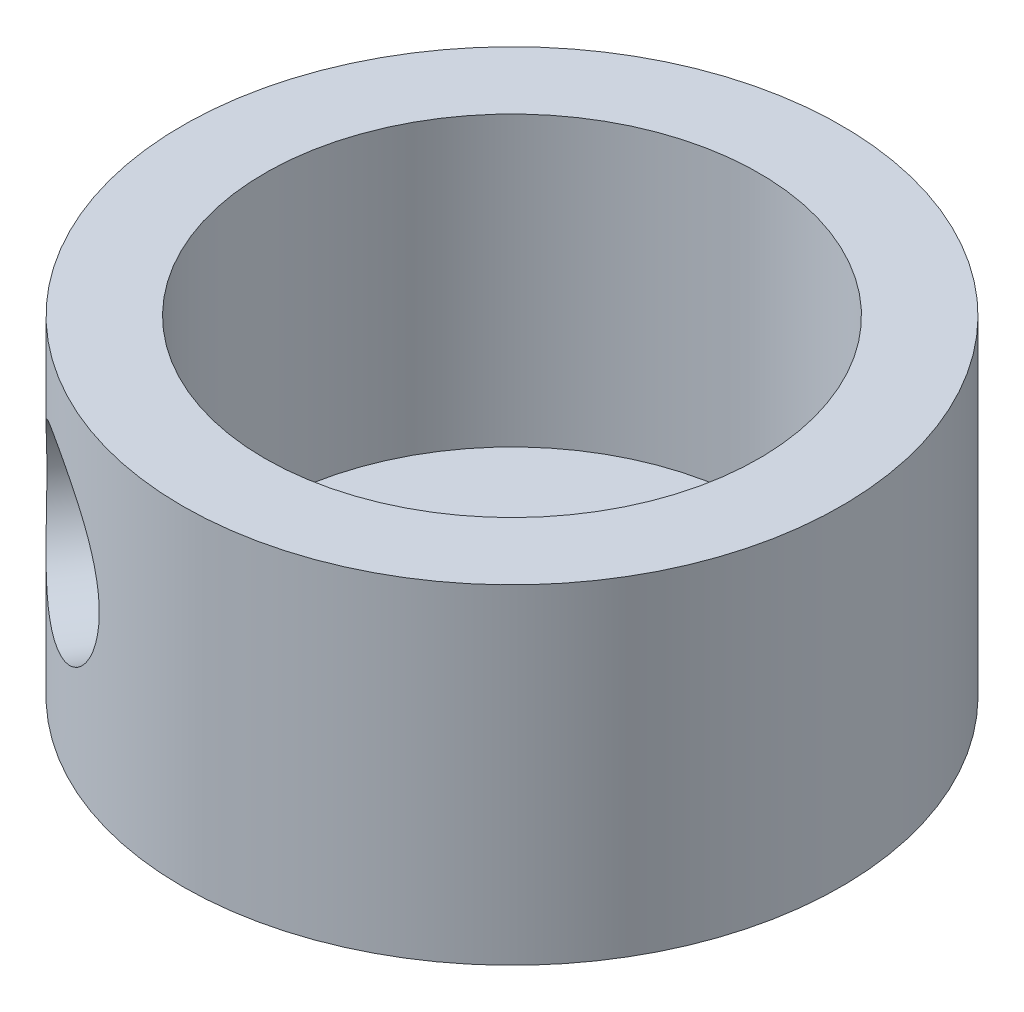
ISO-10303-21;
HEADER;
FILE_DESCRIPTION(('STEP AP214'),'2;1');
FILE_NAME('part.step','',(''),(''),'','','');
FILE_SCHEMA(('AUTOMOTIVE_DESIGN { 1 0 10303 214 1 1 1 1 }'));
ENDSEC;
DATA;
#1=APPLICATION_CONTEXT('core data for automotive mechanical design processes');
#2=APPLICATION_PROTOCOL_DEFINITION('international standard','automotive_design',2000,#1);
#3=PRODUCT_CONTEXT('',#1,'mechanical');
#4=PRODUCT('Part','Part','',(#3));
#5=PRODUCT_RELATED_PRODUCT_CATEGORY('part','',(#4));
#6=PRODUCT_DEFINITION_FORMATION('','',#4);
#7=PRODUCT_DEFINITION_CONTEXT('part definition',#1,'design');
#8=PRODUCT_DEFINITION('design','',#6,#7);
#9=PRODUCT_DEFINITION_SHAPE('','',#8);
#10=(LENGTH_UNIT() NAMED_UNIT(*) SI_UNIT(.MILLI.,.METRE.));
#11=(NAMED_UNIT(*) PLANE_ANGLE_UNIT() SI_UNIT($,.RADIAN.));
#12=(NAMED_UNIT(*) SI_UNIT($,.STERADIAN.) SOLID_ANGLE_UNIT());
#13=UNCERTAINTY_MEASURE_WITH_UNIT(LENGTH_MEASURE(1.E-05),#10,'distance_accuracy_value','');
#14=(GEOMETRIC_REPRESENTATION_CONTEXT(3) GLOBAL_UNCERTAINTY_ASSIGNED_CONTEXT((#13)) GLOBAL_UNIT_ASSIGNED_CONTEXT((#10,
#11,#12)) REPRESENTATION_CONTEXT('',''));
#15=CARTESIAN_POINT('',(0.,0.,0.));
#16=DIRECTION('',(0.,0.,1.));
#17=DIRECTION('',(1.,0.,0.));
#18=AXIS2_PLACEMENT_3D('',#15,#16,#17);
#19=CARTESIAN_POINT('',(0.,40.,0.));
#20=DIRECTION('',(0.,-1.,0.));
#21=DIRECTION('',(0.,0.,-1.));
#22=AXIS2_PLACEMENT_3D('',#19,#20,#21);
#23=CYLINDRICAL_SURFACE('',#22,40.);
#24=CARTESIAN_POINT('',(-11.9219472936567,21.9418173695324,38.1820268284342));
#25=CARTESIAN_POINT('',(-11.9219485564971,21.6457915739465,38.182026843167));
#26=CARTESIAN_POINT('',(-11.9340787709255,21.3497457965336,38.1782453513896));
#27=CARTESIAN_POINT('',(-11.9824553450911,20.7598129156957,38.1630894279006));
#28=CARTESIAN_POINT('',(-12.0187038933685,20.4659260106176,38.1517143071294));
#29=CARTESIAN_POINT('',(-12.1148984395148,19.8823297375246,38.1212772327024));
#30=CARTESIAN_POINT('',(-12.1748547495308,19.5926222443376,38.102211933983));
#31=CARTESIAN_POINT('',(-12.3177546940238,19.0195795097993,38.0562549797366));
#32=CARTESIAN_POINT('',(-12.4006979052965,18.7362441512365,38.0293634682949));
#33=CARTESIAN_POINT('',(-12.588493324008,18.1782903104285,37.9676122725524));
#34=CARTESIAN_POINT('',(-12.6933137137761,17.9036598289065,37.93276415332));
#35=CARTESIAN_POINT('',(-12.9238038929419,17.3645046043392,37.8548554525593));
#36=CARTESIAN_POINT('',(-13.0494737580811,17.0999798980102,37.8117948411967));
#37=CARTESIAN_POINT('',(-13.3203591763773,16.5827618064964,37.717218862599));
#38=CARTESIAN_POINT('',(-13.4655722716006,16.3300669388622,37.6657045583985));
#39=CARTESIAN_POINT('',(-13.7742032302696,15.8379595348734,37.5539380265715));
#40=CARTESIAN_POINT('',(-13.937627566122,15.5985517664268,37.4936826900079));
#41=CARTESIAN_POINT('',(-14.2850561692093,15.1292897964982,37.3627140958644));
#42=CARTESIAN_POINT('',(-14.4694445888559,14.899777689986,37.291793788663));
#43=CARTESIAN_POINT('',(-14.8539629742205,14.4577512136153,37.1403079477416));
#44=CARTESIAN_POINT('',(-15.0540931356395,14.2452370551412,37.0597422941043));
#45=CARTESIAN_POINT('',(-15.4683907843016,13.8385292354389,36.8887396065427));
#46=CARTESIAN_POINT('',(-15.682562183416,13.6443407167846,36.7982998169874));
#47=CARTESIAN_POINT('',(-16.1229830499921,13.2757152159414,36.6074717028507));
#48=CARTESIAN_POINT('',(-16.3492282697357,13.101271353874,36.5070868665525));
#49=CARTESIAN_POINT('',(-16.8157980179616,12.7705598606028,36.2945686671706));
#50=CARTESIAN_POINT('',(-17.056293361993,12.6146399997014,36.1822686527349));
#51=CARTESIAN_POINT('',(-17.5458256307185,12.3255624159477,35.9474295388858));
#52=CARTESIAN_POINT('',(-17.7948626763768,12.1924050156085,35.8248902944331));
#53=CARTESIAN_POINT('',(-18.2993226229423,11.949933992639,35.5698559245818));
#54=CARTESIAN_POINT('',(-18.5547446734107,11.8406172132646,35.4373621203971));
#55=CARTESIAN_POINT('',(-19.0698324935427,11.6467281810364,35.1628587929198));
#56=CARTESIAN_POINT('',(-19.3294981482725,11.5621552591894,35.0208495270218));
#57=CARTESIAN_POINT('',(-19.8448141613022,11.4201675979211,34.7313784179888));
#58=CARTESIAN_POINT('',(-20.1004175342026,11.3621672182472,34.5841200755444));
#59=CARTESIAN_POINT('',(-20.611535193495,11.2709880200223,34.2819594200829));
#60=CARTESIAN_POINT('',(-20.8670494810871,11.2378088530426,34.1270572143993));
#61=CARTESIAN_POINT('',(-21.3759446004128,11.1965717839178,33.8106307874644));
#62=CARTESIAN_POINT('',(-21.6293257413711,11.1885101759,33.6491075466513));
#63=CARTESIAN_POINT('',(-22.1320598086787,11.1975710893368,33.320595564084));
#64=CARTESIAN_POINT('',(-22.3814127933105,11.2146932460819,33.153606901514));
#65=CARTESIAN_POINT('',(-22.8679440326944,11.2732039867969,32.8198405210869));
#66=CARTESIAN_POINT('',(-23.1052705124985,11.3139587973612,32.6531672828523));
#67=CARTESIAN_POINT('',(-23.5728178050311,11.4188823064588,32.3172573041931));
#68=CARTESIAN_POINT('',(-23.8030387600976,11.4830505356434,32.1480206152209));
#69=CARTESIAN_POINT('',(-24.2549823550968,11.6342772533727,31.8084224263598));
#70=CARTESIAN_POINT('',(-24.4767046985083,11.7213365397671,31.6380608874669));
#71=CARTESIAN_POINT('',(-24.9104031979542,11.9176582002548,31.2977284030765));
#72=CARTESIAN_POINT('',(-25.1223791980566,12.02692092943,31.1277574638696));
#73=CARTESIAN_POINT('',(-25.5375350173561,12.2680074659512,30.7880975227127));
#74=CARTESIAN_POINT('',(-25.740607747789,12.4000427100508,30.6184277552599));
#75=CARTESIAN_POINT('',(-26.1348271607195,12.685004456038,30.282633426567));
#76=CARTESIAN_POINT('',(-26.32596938333,12.8379387031019,30.116510206193));
#77=CARTESIAN_POINT('',(-26.6953937888463,13.1635620975129,29.7895416367364));
#78=CARTESIAN_POINT('',(-26.8736790320872,13.3362465182688,29.6286950366666));
#79=CARTESIAN_POINT('',(-27.2168351356898,13.7003401629277,29.3137877502708));
#80=CARTESIAN_POINT('',(-27.3816997860728,13.8917579659389,29.1597302203365));
#81=CARTESIAN_POINT('',(-27.702274826333,14.2982878599121,28.8554039037298));
#82=CARTESIAN_POINT('',(-27.85753907118,14.5139529068663,28.705403323496));
#83=CARTESIAN_POINT('',(-28.1524846407364,14.9623160255126,28.4161971774449));
#84=CARTESIAN_POINT('',(-28.2921726558098,15.1950067126015,28.2769869847919));
#85=CARTESIAN_POINT('',(-28.555642161083,15.6761143113448,28.010897596477));
#86=CARTESIAN_POINT('',(-28.6794157967291,15.9245388988853,27.8840244972681));
#87=CARTESIAN_POINT('',(-28.9105184330448,16.4352902220906,27.644341905963));
#88=CARTESIAN_POINT('',(-29.0178538962372,16.6976114395448,27.5315268903223));
#89=CARTESIAN_POINT('',(-29.2164274811446,17.2362764256752,27.3207153021079));
#90=CARTESIAN_POINT('',(-29.3075549250433,17.5127011716086,27.2228212218583));
#91=CARTESIAN_POINT('',(-29.472512066956,18.0760536126138,27.0441459351377));
#92=CARTESIAN_POINT('',(-29.5463416299068,18.3629813896739,26.9633648622869));
#93=CARTESIAN_POINT('',(-29.6764090325275,18.9452184499096,26.820143799486));
#94=CARTESIAN_POINT('',(-29.7326505130623,19.2405259845887,26.7577000137434));
#95=CARTESIAN_POINT('',(-29.8273357921299,19.8373782062068,26.6521121122163));
#96=CARTESIAN_POINT('',(-29.865780144195,20.138922698857,26.608967396187));
#97=CARTESIAN_POINT('',(-29.9238176235369,20.7367245050457,26.5436807103941));
#98=CARTESIAN_POINT('',(-29.9439472918706,21.0328646681668,26.520941251032));
#99=CARTESIAN_POINT('',(-29.9672418732739,21.6266580216758,26.4946169637237));
#100=CARTESIAN_POINT('',(-29.9704071279815,21.9243111814734,26.4910317500394));
#101=CARTESIAN_POINT('',(-29.9597608487209,22.5188931267627,26.5030713774279));
#102=CARTESIAN_POINT('',(-29.9459510000315,22.8158219812306,26.5186943115266));
#103=CARTESIAN_POINT('',(-29.9014139985922,23.4067908295362,26.5689021939401));
#104=CARTESIAN_POINT('',(-29.8706869412368,23.7008308396541,26.6034870353303));
#105=CARTESIAN_POINT('',(-29.7932084952579,24.2781515342144,26.6902235048328));
#106=CARTESIAN_POINT('',(-29.746783705601,24.5615301105569,26.7420167492639));
#107=CARTESIAN_POINT('',(-29.6379665001651,25.1215232036923,26.8625674110605));
#108=CARTESIAN_POINT('',(-29.5755743488745,25.3981378324423,26.9313245474299));
#109=CARTESIAN_POINT('',(-29.4350469684794,25.9427610304638,27.0848449922696));
#110=CARTESIAN_POINT('',(-29.3569130234005,26.2107702995911,27.1696069952204));
#111=CARTESIAN_POINT('',(-29.185126737665,26.7366005304803,27.3540537459268));
#112=CARTESIAN_POINT('',(-29.0914684554456,26.9944175444333,27.4537442057703));
#113=CARTESIAN_POINT('',(-28.8867349827514,27.5036768500475,27.6690998428026));
#114=CARTESIAN_POINT('',(-28.7753237675165,27.7548565281405,27.7850666299499));
#115=CARTESIAN_POINT('',(-28.5369318920643,28.2433334794542,28.0298538771151));
#116=CARTESIAN_POINT('',(-28.4099442172606,28.4806244265481,28.158680123267));
#117=CARTESIAN_POINT('',(-28.1408186896456,28.9397680196225,28.4276363737601));
#118=CARTESIAN_POINT('',(-27.9986782984482,29.1616180686195,28.5677682710671));
#119=CARTESIAN_POINT('',(-27.699790938312,29.5883613131097,28.8576662044151));
#120=CARTESIAN_POINT('',(-27.5430502297011,29.793261705773,29.0074281028487));
#121=CARTESIAN_POINT('',(-27.2105420469915,30.1907720759621,29.3196168846646));
#122=CARTESIAN_POINT('',(-27.034345969698,30.3828318173997,29.4822884973719));
#123=CARTESIAN_POINT('',(-26.6677241063644,30.7462999546063,29.8143190747726));
#124=CARTESIAN_POINT('',(-26.4773036043877,30.9177159578676,29.9836755452702));
#125=CARTESIAN_POINT('',(-26.0829572351754,31.2387645471355,30.3273431871627));
#126=CARTESIAN_POINT('',(-25.8790291299339,31.3883935101578,30.5016551768677));
#127=CARTESIAN_POINT('',(-25.4586716911438,31.6646876341004,30.8533810826465));
#128=CARTESIAN_POINT('',(-25.2422425641894,31.7913531743755,31.0307949474244));
#129=CARTESIAN_POINT('',(-24.7997271855806,32.0198259383659,31.3855592268318));
#130=CARTESIAN_POINT('',(-24.5737271749909,32.121815381546,31.5628998057961));
#131=CARTESIAN_POINT('',(-24.1118588112119,32.3013227830568,31.9171263219576));
#132=CARTESIAN_POINT('',(-23.875990475401,32.3788407844803,32.0940122599548));
#133=CARTESIAN_POINT('',(-23.3959342726355,32.5087148631042,32.4456277349932));
#134=CARTESIAN_POINT('',(-23.151747975065,32.5610756589663,32.6203576704343));
#135=CARTESIAN_POINT('',(-22.6567012435308,32.6401818663349,32.9661194432821));
#136=CARTESIAN_POINT('',(-22.4058409823967,32.6669279405,33.1371513762451));
#137=CARTESIAN_POINT('',(-21.9071924931358,32.6941297345157,33.4688179753065));
#138=CARTESIAN_POINT('',(-21.6595522362185,32.6953789360203,33.6296105549388));
#139=CARTESIAN_POINT('',(-21.1615368187537,32.6735958194586,33.9451948990643));
#140=CARTESIAN_POINT('',(-20.9111617189639,32.6505640397422,34.0999867965238));
#141=CARTESIAN_POINT('',(-20.4095636547516,32.5804211668785,34.4025507813085));
#142=CARTESIAN_POINT('',(-20.1583407275301,32.5333111169404,34.5503231724559));
#143=CARTESIAN_POINT('',(-19.6569604289342,32.4154136459086,34.8380173021527));
#144=CARTESIAN_POINT('',(-19.4068030623053,32.3446261194765,34.9779390057721));
#145=CARTESIAN_POINT('',(-18.9112716597198,32.1805465140334,35.2483036213255));
#146=CARTESIAN_POINT('',(-18.6658762378912,32.0874184514624,35.3788069912431));
#147=CARTESIAN_POINT('',(-18.1799410739813,31.8791272952421,35.6309511172041));
#148=CARTESIAN_POINT('',(-17.9394012916231,31.7639643844519,35.752591946783));
#149=CARTESIAN_POINT('',(-17.4650472534092,31.5124697732182,35.9866931297203));
#150=CARTESIAN_POINT('',(-17.2312325086665,31.3761396161944,36.0991541515173));
#151=CARTESIAN_POINT('',(-16.7720311746996,31.0832141707517,36.31478137818));
#152=CARTESIAN_POINT('',(-16.5466478462766,30.9266111442535,36.4179440082478));
#153=CARTESIAN_POINT('',(-16.1002950244833,30.5898084518328,36.6175074015466));
#154=CARTESIAN_POINT('',(-15.879602336511,30.4090919909929,36.7136553612603));
#155=CARTESIAN_POINT('',(-15.4507886756573,30.0285901745662,36.8961714219169));
#156=CARTESIAN_POINT('',(-15.2426734883449,29.8287961508151,36.9825350378617));
#157=CARTESIAN_POINT('',(-14.8408458371242,29.4114577272269,37.1456098532816));
#158=CARTESIAN_POINT('',(-14.6471370511636,29.1939088241068,37.222318591308));
#159=CARTESIAN_POINT('',(-14.2759738868577,28.7425934510263,37.3662438942786));
#160=CARTESIAN_POINT('',(-14.0985123947174,28.5088341582575,37.4334646205518));
#161=CARTESIAN_POINT('',(-13.7575158283389,28.0209573363984,37.5601465015436));
#162=CARTESIAN_POINT('',(-13.5943929307102,27.766496102314,37.6193946130289));
#163=CARTESIAN_POINT('',(-13.2884766135699,27.2438509128868,37.7285404951504));
#164=CARTESIAN_POINT('',(-13.1456756447096,26.9756721040511,37.7784417402232));
#165=CARTESIAN_POINT('',(-12.8819095095361,26.4274311692164,37.8691941186278));
#166=CARTESIAN_POINT('',(-12.7609364933838,26.1473733601113,37.9100485066258));
#167=CARTESIAN_POINT('',(-12.5421472105484,25.5772702188257,37.9829943568181));
#168=CARTESIAN_POINT('',(-12.44432784158,25.2872262306343,38.0150869930609));
#169=CARTESIAN_POINT('',(-12.2867525195498,24.7464622312488,38.0662765610464));
#170=CARTESIAN_POINT('',(-12.223407556036,24.4968997761537,38.0866324611262));
#171=CARTESIAN_POINT('',(-12.1144010516572,23.9935429008398,38.1214450122221));
#172=CARTESIAN_POINT('',(-12.0687382898638,23.7397487740739,38.1359020705477));
#173=CARTESIAN_POINT('',(-11.9955065997944,23.2292800360838,38.1590002355114));
#174=CARTESIAN_POINT('',(-11.9679390464416,22.9726052074827,38.1676409002055));
#175=CARTESIAN_POINT('',(-11.9311615483355,22.4578974884636,38.1791533400785));
#176=CARTESIAN_POINT('',(-11.9219461928303,22.199865020818,38.1820268155916));
#177=CARTESIAN_POINT('',(-11.9219472936567,21.9418173695324,38.1820268284342));
#178=B_SPLINE_CURVE_WITH_KNOTS('',3,(#24,#25,#26,#27,#28,#29,#30,#31,#32,#33,#34,#35,#36,#37,
#38,#39,#40,#41,#42,#43,#44,#45,#46,#47,#48,#49,#50,#51,#52,#53,#54,#55,#56,#57,#58,#59,#60,#61,
#62,#63,#64,#65,#66,#67,#68,#69,#70,#71,#72,#73,#74,#75,#76,#77,#78,#79,#80,#81,#82,#83,#84,#85,
#86,#87,#88,#89,#90,#91,#92,#93,#94,#95,#96,#97,#98,#99,#100,#101,#102,#103,#104,#105,#106,#107,
#108,#109,#110,#111,#112,#113,#114,#115,#116,#117,#118,#119,#120,#121,#122,#123,#124,#125,#126,
#127,#128,#129,#130,#131,#132,#133,#134,#135,#136,#137,#138,#139,#140,#141,#142,#143,#144,#145,
#146,#147,#148,#149,#150,#151,#152,#153,#154,#155,#156,#157,#158,#159,#160,#161,#162,#163,#164,
#165,#166,#167,#168,#169,#170,#171,#172,#173,#174,#175,#176,#177),.UNSPECIFIED.,.T.,.F.,(4,2,2,
2,2,2,2,2,2,2,2,2,2,2,2,2,2,2,2,2,2,2,2,2,2,2,2,2,2,2,2,2,2,2,2,2,2,2,2,2,2,2,2,2,2,2,2,2,2,2,2,
2,2,2,2,2,2,2,2,2,2,2,2,2,2,2,2,2,2,2,2,2,2,2,2,2,4),(0.,0.887840507974519,1.77576159115995,
2.66406931831376,3.5523606922197,4.43936904722844,5.32638062461048,6.21328074745654,
7.10049709244529,8.00793416393877,8.91538251845907,9.82308477020942,10.7304697598127,
11.6528406339944,12.57522457583,13.4974863102662,14.419723107448,15.3205207000083,
16.2213056473539,17.1219576855888,18.0225966807751,18.900131617464,19.7776489639299,
20.6551968996187,21.5327588703271,22.4189567032184,23.3054838564773,24.1917992891741,
25.0785225338523,25.9929136534691,26.9069104948756,27.8213567225084,28.7354425156426,
29.6555487391796,30.5756621467416,31.4955849576591,32.4154791549051,33.3074646798179,
34.1994322414036,35.0913112561059,35.9831852416379,36.8575413332505,37.7318829426866,
38.606153262727,39.4807589643759,40.3744866096577,41.2686182174728,42.1628998464765,
43.0567997749156,43.9774116360205,44.8976831944965,45.8181076113211,46.7385168213895,
47.6519063369105,48.565294244,49.4785107627097,50.3917036556587,51.2764324387353,
52.1611416063061,53.0458124464347,53.9304872224184,54.8088557585797,55.6872170057986,
56.5655142369469,57.4441477048588,58.3461488141123,59.2485617285628,60.1512042433362,
61.0534496314488,61.9763645819301,62.8989357807307,63.8211745373337,64.7432896559887,
65.5174490528884,66.2915549857565,67.0657197304927,67.8396561955417),.UNSPECIFIED.);
#179=CARTESIAN_POINT('',(-11.9219472936567,21.9418173695324,38.1820268284342));
#180=VERTEX_POINT('',#179);
#181=EDGE_CURVE('E47',#180,#180,#178,.T.);
#182=ORIENTED_EDGE('',*,*,#181,.T.);
#183=EDGE_LOOP('',(#182));
#184=FACE_BOUND('',#183,.T.);
#185=CARTESIAN_POINT('',(0.,40.,0.));
#186=DIRECTION('',(0.,1.,0.));
#187=DIRECTION('',(0.,0.,1.));
#188=AXIS2_PLACEMENT_3D('',#185,#186,#187);
#189=CIRCLE('',#188,40.);
#190=CARTESIAN_POINT('',(0.,40.,40.));
#191=VERTEX_POINT('',#190);
#192=EDGE_CURVE('E10',#191,#191,#189,.T.);
#193=ORIENTED_EDGE('',*,*,#192,.F.);
#194=EDGE_LOOP('',(#193));
#195=FACE_BOUND('',#194,.T.);
#196=CARTESIAN_POINT('',(0.,0.,0.));
#197=DIRECTION('',(0.,1.,0.));
#198=DIRECTION('',(0.,0.,1.));
#199=AXIS2_PLACEMENT_3D('',#196,#197,#198);
#200=CIRCLE('',#199,40.);
#201=CARTESIAN_POINT('',(0.,0.,40.));
#202=VERTEX_POINT('',#201);
#203=EDGE_CURVE('E35',#202,#202,#200,.T.);
#204=ORIENTED_EDGE('',*,*,#203,.T.);
#205=EDGE_LOOP('',(#204));
#206=FACE_BOUND('',#205,.T.);
#207=ADVANCED_FACE('F31',(#184,#195,#206),#23,.T.);
#208=CARTESIAN_POINT('',(0.,40.,0.));
#209=DIRECTION('',(0.,1.,0.));
#210=DIRECTION('',(0.,0.,1.));
#211=AXIS2_PLACEMENT_3D('',#208,#209,#210);
#212=PLANE('',#211);
#213=CARTESIAN_POINT('',(0.,40.,0.));
#214=DIRECTION('',(0.,1.,0.));
#215=DIRECTION('',(0.,0.,1.));
#216=AXIS2_PLACEMENT_3D('',#213,#214,#215);
#217=CIRCLE('',#216,30.);
#218=CARTESIAN_POINT('',(0.,40.,30.));
#219=VERTEX_POINT('',#218);
#220=EDGE_CURVE('E44',#219,#219,#217,.T.);
#221=ORIENTED_EDGE('',*,*,#220,.F.);
#222=EDGE_LOOP('',(#221));
#223=FACE_BOUND('',#222,.T.);
#224=ORIENTED_EDGE('',*,*,#192,.T.);
#225=EDGE_LOOP('',(#224));
#226=FACE_BOUND('',#225,.T.);
#227=ADVANCED_FACE('F77',(#223,#226),#212,.T.);
#228=CARTESIAN_POINT('',(0.,0.,0.));
#229=DIRECTION('',(0.,1.,0.));
#230=DIRECTION('',(0.,0.,1.));
#231=AXIS2_PLACEMENT_3D('',#228,#229,#230);
#232=PLANE('',#231);
#233=ORIENTED_EDGE('',*,*,#203,.F.);
#234=EDGE_LOOP('',(#233));
#235=FACE_BOUND('',#234,.T.);
#236=ADVANCED_FACE('F75',(#235),#232,.F.);
#237=CARTESIAN_POINT('',(0.,5.,0.));
#238=DIRECTION('',(0.,1.,0.));
#239=DIRECTION('',(0.,0.,1.));
#240=AXIS2_PLACEMENT_3D('',#237,#238,#239);
#241=CYLINDRICAL_SURFACE('',#240,30.);
#242=CARTESIAN_POINT('',(-6.20275668331238,21.9418173695324,29.3517599051168));
#243=CARTESIAN_POINT('',(-6.20275559317333,22.2331210589464,29.3517597521828));
#244=CARTESIAN_POINT('',(-6.21518024177391,22.5244129397282,29.3491426334062));
#245=CARTESIAN_POINT('',(-6.26468825531875,23.1047840297218,29.3386148829619));
#246=CARTESIAN_POINT('',(-6.30177034060511,23.3938633529721,29.3307045259996));
#247=CARTESIAN_POINT('',(-6.40004945290652,23.9676854521526,29.3094163293735));
#248=CARTESIAN_POINT('',(-6.46124698185489,24.2524281376927,29.2960383759082));
#249=CARTESIAN_POINT('',(-6.60689730149487,24.8155631844302,29.2635347526117));
#250=CARTESIAN_POINT('',(-6.69135057577514,25.0939554134434,29.2444089632571));
#251=CARTESIAN_POINT('',(-6.88215895244236,25.6418477225951,29.2000932521139));
#252=CARTESIAN_POINT('',(-6.98845965151091,25.9113679973339,29.1749183676252));
#253=CARTESIAN_POINT('',(-7.22183362520947,26.4406532755126,29.1180277321761));
#254=CARTESIAN_POINT('',(-7.34891462544893,26.7004146064775,29.0863095474246));
#255=CARTESIAN_POINT('',(-7.62239158946652,27.2085575659225,29.0158417923191));
#256=CARTESIAN_POINT('',(-7.76878760246646,27.4569391654006,28.9770922040465));
#257=CARTESIAN_POINT('',(-8.07938956457457,27.940955185488,28.8920297910912));
#258=CARTESIAN_POINT('',(-8.24359670165121,28.1765887542547,28.845716461817));
#259=CARTESIAN_POINT('',(-8.59535304917007,28.6432427204592,28.7429093691241));
#260=CARTESIAN_POINT('',(-8.7835849222522,28.8736738131396,28.6860749798213));
#261=CARTESIAN_POINT('',(-9.17585439569612,29.3179830196671,28.5630170600169));
#262=CARTESIAN_POINT('',(-9.3798923405743,29.5318607725069,28.4967933248345));
#263=CARTESIAN_POINT('',(-9.80197868696119,29.9418256202886,28.3543792565931));
#264=CARTESIAN_POINT('',(-10.020029935995,30.1379090797527,28.2781868946147));
#265=CARTESIAN_POINT('',(-10.4682146618415,30.5109921840839,28.1153573573964));
#266=CARTESIAN_POINT('',(-10.6983477696074,30.6879924113546,28.0287205010844));
#267=CARTESIAN_POINT('',(-11.1760696106551,31.0268956056976,27.8417540315901));
#268=CARTESIAN_POINT('',(-11.4239783362399,31.1881602490838,27.7410831334994));
#269=CARTESIAN_POINT('',(-11.9282890379592,31.4878054651194,27.5280005255201));
#270=CARTESIAN_POINT('',(-12.1846875790152,31.6261951606542,27.4155935254971));
#271=CARTESIAN_POINT('',(-12.7037823082376,31.8789740002421,27.1789489378235));
#272=CARTESIAN_POINT('',(-12.9664783038974,31.9933638769052,27.0547117114666));
#273=CARTESIAN_POINT('',(-13.4958004331229,32.1970670220093,26.7945947283284));
#274=CARTESIAN_POINT('',(-13.7624263690369,32.2863815470868,26.6587155554219));
#275=CARTESIAN_POINT('',(-14.2865602955126,32.4359997919686,26.3814059642093));
#276=CARTESIAN_POINT('',(-14.5440098355729,32.4973148483336,26.2404103679998));
#277=CARTESIAN_POINT('',(-15.0581376039349,32.5953823885321,25.9487922219082));
#278=CARTESIAN_POINT('',(-15.3148158507123,32.6321354654762,25.7981699045836));
#279=CARTESIAN_POINT('',(-15.8252042817042,32.6806928836282,25.4882722236435));
#280=CARTESIAN_POINT('',(-16.0789152050282,32.6925035750967,25.3289990731004));
#281=CARTESIAN_POINT('',(-16.5813886876462,32.6910696175703,25.0029445575468));
#282=CARTESIAN_POINT('',(-16.830151381581,32.677825651255,24.8361633972326));
#283=CARTESIAN_POINT('',(-17.3097033718701,32.6275915802453,24.5041902493145));
#284=CARTESIAN_POINT('',(-17.5407963617152,32.5917044516918,24.3392685754001));
#285=CARTESIAN_POINT('',(-17.9952447513378,32.4975664647992,24.0052221346245));
#286=CARTESIAN_POINT('',(-18.2186004273161,32.4393164056534,23.8360975181676));
#287=CARTESIAN_POINT('',(-18.6562790292595,32.3009779055826,23.4951106335178));
#288=CARTESIAN_POINT('',(-18.8706016252995,32.220888667798,23.3232482656463));
#289=CARTESIAN_POINT('',(-19.2891023225293,32.0395581730856,22.9783391219878));
#290=CARTESIAN_POINT('',(-19.4932801747656,31.9383163973882,22.8052923172528));
#291=CARTESIAN_POINT('',(-19.893328590725,31.7139481318974,22.4572204652984));
#292=CARTESIAN_POINT('',(-20.0890450524512,31.5905381230727,22.2822011895364));
#293=CARTESIAN_POINT('',(-20.4684260473304,31.3236996766669,21.9342158748141));
#294=CARTESIAN_POINT('',(-20.6520861914757,31.180264007668,21.7612506021612));
#295=CARTESIAN_POINT('',(-21.0067102729815,30.874399973679,21.4191231474219));
#296=CARTESIAN_POINT('',(-21.177673502776,30.7119705515132,21.2499611776494));
#297=CARTESIAN_POINT('',(-21.5064670071486,30.3691608384561,20.9171367653344));
#298=CARTESIAN_POINT('',(-21.664296446801,30.1887794079394,20.7534746728172));
#299=CARTESIAN_POINT('',(-21.9746390752478,29.8009623127055,20.4247167311091));
#300=CARTESIAN_POINT('',(-22.1264076869468,29.5925926399977,20.2600187148135));
#301=CARTESIAN_POINT('',(-22.414714976652,29.1584043359569,19.9405831695911));
#302=CARTESIAN_POINT('',(-22.5512531655705,28.9325851446693,19.7858459605987));
#303=CARTESIAN_POINT('',(-22.8089158804019,28.4647952896522,19.4882557367723));
#304=CARTESIAN_POINT('',(-22.9300367837399,28.222820850237,19.3454055177255));
#305=CARTESIAN_POINT('',(-23.1566454616624,27.7242170004806,19.0735705178192));
#306=CARTESIAN_POINT('',(-23.2621339320485,27.4675882431098,18.944585119905));
#307=CARTESIAN_POINT('',(-23.4591853630609,26.9362028993585,18.7000470687452));
#308=CARTESIAN_POINT('',(-23.5504449030766,26.6611941753268,18.584796972837));
#309=CARTESIAN_POINT('',(-23.7163715852476,26.0994972501739,18.3725846858542));
#310=CARTESIAN_POINT('',(-23.7910457011245,25.8128140180987,18.2756148110457));
#311=CARTESIAN_POINT('',(-23.9236789167434,25.2297350311698,18.1016453199216));
#312=CARTESIAN_POINT('',(-23.9816411821976,24.9333411276627,18.0246419216513));
#313=CARTESIAN_POINT('',(-24.0807193220946,24.3330411358772,17.8920603596432));
#314=CARTESIAN_POINT('',(-24.1218362317179,24.0291355104265,17.8364808793756));
#315=CARTESIAN_POINT('',(-24.185436561862,23.4319448340781,17.7501374443939));
#316=CARTESIAN_POINT('',(-24.2087656810259,23.138911898254,17.7182493629593));
#317=CARTESIAN_POINT('',(-24.2400858600487,22.5505072279945,17.6753769609517));
#318=CARTESIAN_POINT('',(-24.2480774434995,22.2551355737437,17.6643919267919));
#319=CARTESIAN_POINT('',(-24.2486988255311,21.6644052068467,17.6635388293705));
#320=CARTESIAN_POINT('',(-24.2413316157993,21.3690465028846,17.6736666536064));
#321=CARTESIAN_POINT('',(-24.2112639594557,20.7805809160684,17.7148340497661));
#322=CARTESIAN_POINT('',(-24.188563761679,20.4874739967488,17.7458732823239));
#323=CARTESIAN_POINT('',(-24.1291765568524,19.9179995600292,17.8265314253378));
#324=CARTESIAN_POINT('',(-24.0931187945469,19.6414469023895,17.8753128957984));
#325=CARTESIAN_POINT('',(-24.0070699214192,19.0941969247981,17.9907134453128));
#326=CARTESIAN_POINT('',(-23.9570739102771,18.8235017002995,18.0573387974791));
#327=CARTESIAN_POINT('',(-23.843274814852,18.2898422031351,18.2073363253073));
#328=CARTESIAN_POINT('',(-23.7794748803424,18.026876182345,18.2907046802467));
#329=CARTESIAN_POINT('',(-23.638152660174,17.5100700941923,18.4729811854356));
#330=CARTESIAN_POINT('',(-23.5606250519777,17.2562336126579,18.5718953614823));
#331=CARTESIAN_POINT('',(-23.3890460410716,16.750545904481,18.7875533225208));
#332=CARTESIAN_POINT('',(-23.2945132057573,16.4990716896056,18.9047980776345));
#333=CARTESIAN_POINT('',(-23.0909932873368,16.0088441939144,19.1528527613015));
#334=CARTESIAN_POINT('',(-22.9819997580869,15.7700966531918,19.283668733792));
#335=CARTESIAN_POINT('',(-22.7497269930689,15.306732402581,19.5571495938338));
#336=CARTESIAN_POINT('',(-22.6264466861377,15.0821167541939,19.6998153696065));
#337=CARTESIAN_POINT('',(-22.3657735886582,14.6482581783489,19.9952739330864));
#338=CARTESIAN_POINT('',(-22.2283803946137,14.4390156907128,20.1480670102953));
#339=CARTESIAN_POINT('',(-21.9314199531072,14.0255603853764,20.4710440157811));
#340=CARTESIAN_POINT('',(-21.771033629998,13.8223209881732,20.6417227825973));
#341=CARTESIAN_POINT('',(-21.4351090353532,13.4357369543357,20.9903470193816));
#342=CARTESIAN_POINT('',(-21.2595761687356,13.2523852732181,21.1682898853712));
#343=CARTESIAN_POINT('',(-20.8936837601217,12.906707604714,21.5295165849954));
#344=CARTESIAN_POINT('',(-20.7033180702465,12.7443904106902,21.7128026133428));
#345=CARTESIAN_POINT('',(-20.3085315890288,12.4421836445184,22.0824960790002));
#346=CARTESIAN_POINT('',(-20.1041168328052,12.3022845271245,22.2689021503081));
#347=CARTESIAN_POINT('',(-19.6830030721679,12.046618612072,22.641955017933));
#348=CARTESIAN_POINT('',(-19.4663673646736,11.9307398062417,22.8285964176151));
#349=CARTESIAN_POINT('',(-19.02099485808,11.7233314295662,23.2009913399862));
#350=CARTESIAN_POINT('',(-18.7922580192577,11.6318019386554,23.3867448597584));
#351=CARTESIAN_POINT('',(-18.3241007369854,11.4740204096101,23.7553373260092));
#352=CARTESIAN_POINT('',(-18.0846840699736,11.4077595142902,23.9381772721847));
#353=CARTESIAN_POINT('',(-17.5967007827329,11.301165841006,24.2991399728223));
#354=CARTESIAN_POINT('',(-17.3481346333684,11.2608317307257,24.4772629692262));
#355=CARTESIAN_POINT('',(-16.8572719703561,11.2079860077846,24.8176701245271));
#356=CARTESIAN_POINT('',(-16.6153564261315,11.1940956483258,24.9802910384823));
#357=CARTESIAN_POINT('',(-16.1267437681345,11.1900554245104,25.2984805740929));
#358=CARTESIAN_POINT('',(-15.8800468368083,11.1999046560705,25.4540494640831));
#359=CARTESIAN_POINT('',(-15.3837711616543,11.2432417882525,25.7570204736386));
#360=CARTESIAN_POINT('',(-15.1341927080482,11.2767273283485,25.9044234071416));
#361=CARTESIAN_POINT('',(-14.6340865347975,11.3670052598826,26.1901977251794));
#362=CARTESIAN_POINT('',(-14.3835588143511,11.4237976710098,26.3285691020845));
#363=CARTESIAN_POINT('',(-13.8887910679492,11.5587204867686,26.5928279573445));
#364=CARTESIAN_POINT('',(-13.6445292553305,11.6363790282572,26.7189162152863));
#365=CARTESIAN_POINT('',(-13.1587817972414,11.8128825678063,26.9614574480314));
#366=CARTESIAN_POINT('',(-12.9172971721647,11.9117351064363,27.0779069729968));
#367=CARTESIAN_POINT('',(-12.439075575333,12.1297900159475,27.3008973640178));
#368=CARTESIAN_POINT('',(-12.20233752481,12.2489877029752,27.407440502017));
#369=CARTESIAN_POINT('',(-11.735234341507,12.5069100501905,27.6106715445094));
#370=CARTESIAN_POINT('',(-11.5048717087546,12.6456422442841,27.7073556217194));
#371=CARTESIAN_POINT('',(-11.0433159826104,12.9475436424717,27.8946167017916));
#372=CARTESIAN_POINT('',(-10.812454371679,13.1114653998912,27.9847977824958));
#373=CARTESIAN_POINT('',(-10.3613315715512,13.4583206981981,28.1549456160498));
#374=CARTESIAN_POINT('',(-10.1410752346468,13.6412628228911,28.2349077205162));
#375=CARTESIAN_POINT('',(-9.71305357092139,14.024967167643,28.3849966363133));
#376=CARTESIAN_POINT('',(-9.5052893855645,14.2257310120146,28.455122549645));
#377=CARTESIAN_POINT('',(-9.10403081446998,14.6438792880183,28.5860310300083));
#378=CARTESIAN_POINT('',(-8.91053668982346,14.8612640236052,28.6468134261091));
#379=CARTESIAN_POINT('',(-8.53074640415074,15.3220964481932,28.7622601514476));
#380=CARTESIAN_POINT('',(-8.34522558408903,15.5662909864152,28.8164981894329));
#381=CARTESIAN_POINT('',(-7.99374032024441,16.0699660659746,28.9159726842208));
#382=CARTESIAN_POINT('',(-7.82776857851416,16.3294408483727,28.9612125045566));
#383=CARTESIAN_POINT('',(-7.51712163299027,16.8622490606282,29.0433937299107));
#384=CARTESIAN_POINT('',(-7.37245506852858,17.1355880524048,29.0803317717023));
#385=CARTESIAN_POINT('',(-7.10636064594969,17.6941127922207,29.1464996336802));
#386=CARTESIAN_POINT('',(-6.98492260377986,17.9792932815523,29.1757328340251));
#387=CARTESIAN_POINT('',(-6.76609582203551,18.5616609538077,29.2272593248035));
#388=CARTESIAN_POINT('',(-6.66888164039522,18.8589182913627,29.2495025285631));
#389=CARTESIAN_POINT('',(-6.50107714921528,19.4612899253517,29.2872567384694));
#390=CARTESIAN_POINT('',(-6.43048713032274,19.7664043075198,29.3027676711223));
#391=CARTESIAN_POINT('',(-6.31709327605127,20.3818784674748,29.3274224511598));
#392=CARTESIAN_POINT('',(-6.27427739444524,20.6922359112264,29.3365690590109));
#393=CARTESIAN_POINT('',(-6.21711063957339,21.3156726955783,29.3487376625358));
#394=CARTESIAN_POINT('',(-6.20275785489022,21.6287518519857,29.3517600694758));
#395=CARTESIAN_POINT('',(-6.20275668331238,21.9418173695324,29.3517599051168));
#396=B_SPLINE_CURVE_WITH_KNOTS('',3,(#242,#243,#244,#245,#246,#247,#248,#249,#250,#251,#252,
#253,#254,#255,#256,#257,#258,#259,#260,#261,#262,#263,#264,#265,#266,#267,#268,#269,#270,#271,
#272,#273,#274,#275,#276,#277,#278,#279,#280,#281,#282,#283,#284,#285,#286,#287,#288,#289,#290,
#291,#292,#293,#294,#295,#296,#297,#298,#299,#300,#301,#302,#303,#304,#305,#306,#307,#308,#309,
#310,#311,#312,#313,#314,#315,#316,#317,#318,#319,#320,#321,#322,#323,#324,#325,#326,#327,#328,
#329,#330,#331,#332,#333,#334,#335,#336,#337,#338,#339,#340,#341,#342,#343,#344,#345,#346,#347,
#348,#349,#350,#351,#352,#353,#354,#355,#356,#357,#358,#359,#360,#361,#362,#363,#364,#365,#366,
#367,#368,#369,#370,#371,#372,#373,#374,#375,#376,#377,#378,#379,#380,#381,#382,#383,#384,#385,
#386,#387,#388,#389,#390,#391,#392,#393,#394,#395),.UNSPECIFIED.,.T.,.F.,(4,2,2,2,2,2,2,2,2,2,2,
2,2,2,2,2,2,2,2,2,2,2,2,2,2,2,2,2,2,2,2,2,2,2,2,2,2,2,2,2,2,2,2,2,2,2,2,2,2,2,2,2,2,2,2,2,2,2,2,
2,2,2,2,2,2,2,2,2,2,2,2,2,2,2,2,2,4),(0.,0.873615677594879,1.74718602030915,2.62077454627705,
3.49438123934273,4.36583832194666,5.23762013075221,6.10940416122382,6.98124637384774,
7.88898192823321,8.7967372736092,9.70467766310815,10.6125903352048,11.5486556616275,
12.4843467651554,13.4200093019459,14.3556249401879,15.2540806160129,16.1525145955927,
17.0507198088354,17.948900548482,18.8063901627356,19.6638491353785,20.5213393988424,
21.3788506948674,22.2482311607603,23.1179263824573,23.9876700336909,24.8574689330601,
25.774130650918,26.690821796655,27.6077279397944,28.5245932590594,29.4589175875356,
30.3928483110685,31.3266020044616,32.2602983082289,33.1462249937792,34.0321214350772,
34.9178453317169,35.8035548545144,36.6519667575276,37.5006773167146,38.3491944213287,
39.19804123897,40.0764503253729,40.9552523041411,41.8341202145004,42.7130132592419,
43.6422128203751,44.5710821648537,45.5003385744122,46.4291982645858,47.3536240297001,
48.2780528295062,49.2021572986783,50.1262142765175,51.0006104578974,51.8749733398627,
52.7492489127564,53.6235252242191,54.4794889176182,55.3357576594918,56.1918295366868,
57.0482324855085,57.9387022237031,58.8295755857228,59.7205302275253,60.6115011665723,
61.5446839838764,62.4775173192285,63.4107278866833,64.3435283652283,65.2828679506446,
66.2222177902218,67.1611599411434,68.1000390359923),.UNSPECIFIED.);
#397=CARTESIAN_POINT('',(-6.20275668331238,21.9418173695324,29.3517599051168));
#398=VERTEX_POINT('',#397);
#399=EDGE_CURVE('E56',#398,#398,#396,.T.);
#400=ORIENTED_EDGE('',*,*,#399,.T.);
#401=EDGE_LOOP('',(#400));
#402=FACE_BOUND('',#401,.T.);
#403=CARTESIAN_POINT('',(0.,5.,0.));
#404=DIRECTION('',(0.,1.,0.));
#405=DIRECTION('',(0.,0.,1.));
#406=AXIS2_PLACEMENT_3D('',#403,#404,#405);
#407=CIRCLE('',#406,30.);
#408=CARTESIAN_POINT('',(0.,5.,30.));
#409=VERTEX_POINT('',#408);
#410=EDGE_CURVE('E42',#409,#409,#407,.T.);
#411=ORIENTED_EDGE('',*,*,#410,.F.);
#412=EDGE_LOOP('',(#411));
#413=FACE_BOUND('',#412,.T.);
#414=ORIENTED_EDGE('',*,*,#220,.T.);
#415=EDGE_LOOP('',(#414));
#416=FACE_BOUND('',#415,.T.);
#417=ADVANCED_FACE('F71',(#402,#413,#416),#241,.F.);
#418=CARTESIAN_POINT('',(0.,5.,0.));
#419=DIRECTION('',(0.,1.,0.));
#420=DIRECTION('',(0.,0.,1.));
#421=AXIS2_PLACEMENT_3D('',#418,#419,#420);
#422=PLANE('',#421);
#423=ORIENTED_EDGE('',*,*,#410,.T.);
#424=EDGE_LOOP('',(#423));
#425=FACE_BOUND('',#424,.T.);
#426=ADVANCED_FACE('F64',(#425),#422,.T.);
#427=CARTESIAN_POINT('',(-21.7447581507004,21.9418173695324,33.5732854062207));
#428=DIRECTION('',(-0.543618953767509,0.,0.839332135155517));
#429=DIRECTION('',(0.839332135155517,0.,0.543618953767509));
#430=AXIS2_PLACEMENT_3D('',#427,#428,#429);
#431=CYLINDRICAL_SURFACE('',#430,10.75);
#432=ORIENTED_EDGE('',*,*,#399,.F.);
#433=EDGE_LOOP('',(#432));
#434=FACE_BOUND('',#433,.T.);
#435=ORIENTED_EDGE('',*,*,#181,.F.);
#436=EDGE_LOOP('',(#435));
#437=FACE_BOUND('',#436,.T.);
#438=ADVANCED_FACE('F61',(#434,#437),#431,.F.);
#439=CLOSED_SHELL('',(#207,#227,#236,#417,#426,#438));
#440=MANIFOLD_SOLID_BREP('B2',#439);
#441=ADVANCED_BREP_SHAPE_REPRESENTATION('',(#18,#440),#14);
#442=SHAPE_DEFINITION_REPRESENTATION(#9,#441);
ENDSEC;
END-ISO-10303-21;
